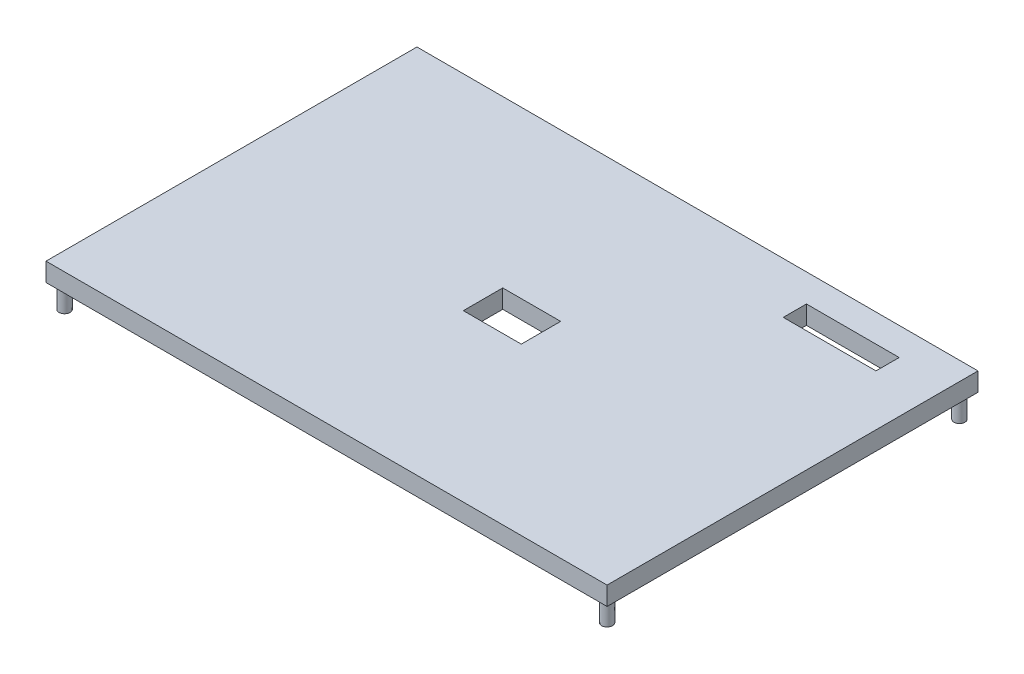
ISO-10303-21;
HEADER;
FILE_DESCRIPTION(('STEP AP214'),'2;1');
FILE_NAME('part.step','',(''),(''),'','','');
FILE_SCHEMA(('AUTOMOTIVE_DESIGN { 1 0 10303 214 1 1 1 1 }'));
ENDSEC;
DATA;
#1=APPLICATION_CONTEXT('core data for automotive mechanical design processes');
#2=APPLICATION_PROTOCOL_DEFINITION('international standard','automotive_design',2000,#1);
#3=PRODUCT_CONTEXT('',#1,'mechanical');
#4=PRODUCT('Part','Part','',(#3));
#5=PRODUCT_RELATED_PRODUCT_CATEGORY('part','',(#4));
#6=PRODUCT_DEFINITION_FORMATION('','',#4);
#7=PRODUCT_DEFINITION_CONTEXT('part definition',#1,'design');
#8=PRODUCT_DEFINITION('design','',#6,#7);
#9=PRODUCT_DEFINITION_SHAPE('','',#8);
#10=(LENGTH_UNIT() NAMED_UNIT(*) SI_UNIT(.MILLI.,.METRE.));
#11=(NAMED_UNIT(*) PLANE_ANGLE_UNIT() SI_UNIT($,.RADIAN.));
#12=(NAMED_UNIT(*) SI_UNIT($,.STERADIAN.) SOLID_ANGLE_UNIT());
#13=UNCERTAINTY_MEASURE_WITH_UNIT(LENGTH_MEASURE(1.E-05),#10,'distance_accuracy_value','');
#14=(GEOMETRIC_REPRESENTATION_CONTEXT(3) GLOBAL_UNCERTAINTY_ASSIGNED_CONTEXT((#13)) GLOBAL_UNIT_ASSIGNED_CONTEXT((#10,
#11,#12)) REPRESENTATION_CONTEXT('',''));
#15=CARTESIAN_POINT('',(0.,0.,0.));
#16=DIRECTION('',(0.,0.,1.));
#17=DIRECTION('',(1.,0.,0.));
#18=AXIS2_PLACEMENT_3D('',#15,#16,#17);
#19=CARTESIAN_POINT('',(0.,4.,0.));
#20=DIRECTION('',(0.,-1.,0.));
#21=DIRECTION('',(0.,0.,-1.));
#22=AXIS2_PLACEMENT_3D('',#19,#20,#21);
#23=PLANE('',#22);
#24=DIRECTION('',(0.,0.,1.));
#25=VECTOR('',#24,1.);
#26=CARTESIAN_POINT('',(29.5,4.,-34.));
#27=LINE('',#26,#25);
#28=CARTESIAN_POINT('',(29.5,4.,-34.));
#29=VERTEX_POINT('',#28);
#30=CARTESIAN_POINT('',(29.5,4.,-29.));
#31=VERTEX_POINT('',#30);
#32=EDGE_CURVE('E183',#29,#31,#27,.T.);
#33=ORIENTED_EDGE('',*,*,#32,.F.);
#34=DIRECTION('',(-1.,0.,0.));
#35=VECTOR('',#34,1.);
#36=CARTESIAN_POINT('',(29.5,4.,-34.));
#37=LINE('',#36,#35);
#38=CARTESIAN_POINT('',(49.5,4.,-34.));
#39=VERTEX_POINT('',#38);
#40=EDGE_CURVE('E194',#39,#29,#37,.T.);
#41=ORIENTED_EDGE('',*,*,#40,.F.);
#42=DIRECTION('',(0.,0.,-1.));
#43=VECTOR('',#42,1.);
#44=CARTESIAN_POINT('',(49.5,4.,-34.));
#45=LINE('',#44,#43);
#46=CARTESIAN_POINT('',(49.5,4.,-29.));
#47=VERTEX_POINT('',#46);
#48=EDGE_CURVE('E190',#47,#39,#45,.T.);
#49=ORIENTED_EDGE('',*,*,#48,.F.);
#50=DIRECTION('',(1.,0.,0.));
#51=VECTOR('',#50,1.);
#52=CARTESIAN_POINT('',(29.5,4.,-29.));
#53=LINE('',#52,#51);
#54=EDGE_CURVE('E186',#31,#47,#53,.T.);
#55=ORIENTED_EDGE('',*,*,#54,.F.);
#56=EDGE_LOOP('',(#33,#41,#49,#55));
#57=FACE_BOUND('',#56,.T.);
#58=DIRECTION('',(0.,0.,-1.));
#59=VECTOR('',#58,1.);
#60=CARTESIAN_POINT('',(60.5,4.,40.));
#61=LINE('',#60,#59);
#62=CARTESIAN_POINT('',(60.5,4.,40.));
#63=VERTEX_POINT('',#62);
#64=CARTESIAN_POINT('',(60.5,4.,-40.));
#65=VERTEX_POINT('',#64);
#66=EDGE_CURVE('E226',#63,#65,#61,.T.);
#67=ORIENTED_EDGE('',*,*,#66,.T.);
#68=DIRECTION('',(-1.,0.,0.));
#69=VECTOR('',#68,1.);
#70=CARTESIAN_POINT('',(-60.5,4.,-40.));
#71=LINE('',#70,#69);
#72=CARTESIAN_POINT('',(-60.5,4.,-40.));
#73=VERTEX_POINT('',#72);
#74=EDGE_CURVE('E230',#65,#73,#71,.T.);
#75=ORIENTED_EDGE('',*,*,#74,.T.);
#76=DIRECTION('',(0.,0.,1.));
#77=VECTOR('',#76,1.);
#78=CARTESIAN_POINT('',(-60.5,4.,40.));
#79=LINE('',#78,#77);
#80=CARTESIAN_POINT('',(-60.5,4.,40.));
#81=VERTEX_POINT('',#80);
#82=EDGE_CURVE('E234',#73,#81,#79,.T.);
#83=ORIENTED_EDGE('',*,*,#82,.T.);
#84=DIRECTION('',(1.,0.,0.));
#85=VECTOR('',#84,1.);
#86=CARTESIAN_POINT('',(-60.5,4.,40.));
#87=LINE('',#86,#85);
#88=EDGE_CURVE('E237',#81,#63,#87,.T.);
#89=ORIENTED_EDGE('',*,*,#88,.T.);
#90=EDGE_LOOP('',(#67,#75,#83,#89));
#91=FACE_BOUND('',#90,.T.);
#92=DIRECTION('',(0.,0.,-1.));
#93=VECTOR('',#92,1.);
#94=CARTESIAN_POINT('',(6.25,4.,4.25));
#95=LINE('',#94,#93);
#96=CARTESIAN_POINT('',(6.25,4.,4.25));
#97=VERTEX_POINT('',#96);
#98=CARTESIAN_POINT('',(6.25,4.,-4.25));
#99=VERTEX_POINT('',#98);
#100=EDGE_CURVE('E133',#97,#99,#95,.T.);
#101=ORIENTED_EDGE('',*,*,#100,.F.);
#102=DIRECTION('',(1.,0.,0.));
#103=VECTOR('',#102,1.);
#104=CARTESIAN_POINT('',(-6.25,4.,4.25));
#105=LINE('',#104,#103);
#106=CARTESIAN_POINT('',(-6.25,4.,4.25));
#107=VERTEX_POINT('',#106);
#108=EDGE_CURVE('E159',#107,#97,#105,.T.);
#109=ORIENTED_EDGE('',*,*,#108,.F.);
#110=DIRECTION('',(0.,0.,1.));
#111=VECTOR('',#110,1.);
#112=CARTESIAN_POINT('',(-6.25,4.,4.25));
#113=LINE('',#112,#111);
#114=CARTESIAN_POINT('',(-6.25,4.,-4.25));
#115=VERTEX_POINT('',#114);
#116=EDGE_CURVE('E155',#115,#107,#113,.T.);
#117=ORIENTED_EDGE('',*,*,#116,.F.);
#118=DIRECTION('',(-1.,0.,0.));
#119=VECTOR('',#118,1.);
#120=CARTESIAN_POINT('',(-6.25,4.,-4.25));
#121=LINE('',#120,#119);
#122=EDGE_CURVE('E142',#99,#115,#121,.T.);
#123=ORIENTED_EDGE('',*,*,#122,.F.);
#124=EDGE_LOOP('',(#101,#109,#117,#123));
#125=FACE_BOUND('',#124,.T.);
#126=ADVANCED_FACE('F43',(#57,#91,#125),#23,.F.);
#127=CARTESIAN_POINT('',(0.,0.,0.));
#128=DIRECTION('',(0.,-1.,0.));
#129=DIRECTION('',(0.,0.,-1.));
#130=AXIS2_PLACEMENT_3D('',#127,#128,#129);
#131=PLANE('',#130);
#132=CARTESIAN_POINT('',(58.5,0.,38.));
#133=DIRECTION('',(0.,-1.,0.));
#134=DIRECTION('',(0.,0.,-1.));
#135=AXIS2_PLACEMENT_3D('',#132,#133,#134);
#136=CIRCLE('',#135,1.185);
#137=CARTESIAN_POINT('',(58.5,0.,36.815));
#138=VERTEX_POINT('',#137);
#139=EDGE_CURVE('E380',#138,#138,#136,.T.);
#140=ORIENTED_EDGE('',*,*,#139,.F.);
#141=EDGE_LOOP('',(#140));
#142=FACE_BOUND('',#141,.T.);
#143=CARTESIAN_POINT('',(58.5,0.,-38.));
#144=DIRECTION('',(0.,-1.,0.));
#145=DIRECTION('',(0.,0.,1.));
#146=AXIS2_PLACEMENT_3D('',#143,#144,#145);
#147=CIRCLE('',#146,1.185);
#148=CARTESIAN_POINT('',(58.5,0.,-36.815));
#149=VERTEX_POINT('',#148);
#150=EDGE_CURVE('E387',#149,#149,#147,.T.);
#151=ORIENTED_EDGE('',*,*,#150,.F.);
#152=EDGE_LOOP('',(#151));
#153=FACE_BOUND('',#152,.T.);
#154=CARTESIAN_POINT('',(-58.5,0.,38.));
#155=DIRECTION('',(0.,-1.,0.));
#156=DIRECTION('',(0.,0.,1.));
#157=AXIS2_PLACEMENT_3D('',#154,#155,#156);
#158=CIRCLE('',#157,1.185);
#159=CARTESIAN_POINT('',(-58.5,0.,39.185));
#160=VERTEX_POINT('',#159);
#161=EDGE_CURVE('E395',#160,#160,#158,.T.);
#162=ORIENTED_EDGE('',*,*,#161,.F.);
#163=EDGE_LOOP('',(#162));
#164=FACE_BOUND('',#163,.T.);
#165=CARTESIAN_POINT('',(-58.5,0.,-38.));
#166=DIRECTION('',(0.,-1.,0.));
#167=DIRECTION('',(0.,0.,-1.));
#168=AXIS2_PLACEMENT_3D('',#165,#166,#167);
#169=CIRCLE('',#168,1.185);
#170=CARTESIAN_POINT('',(-58.5,0.,-39.185));
#171=VERTEX_POINT('',#170);
#172=EDGE_CURVE('E399',#171,#171,#169,.T.);
#173=ORIENTED_EDGE('',*,*,#172,.F.);
#174=EDGE_LOOP('',(#173));
#175=FACE_BOUND('',#174,.T.);
#176=DIRECTION('',(0.,0.,-1.));
#177=VECTOR('',#176,1.);
#178=CARTESIAN_POINT('',(60.5,0.,40.));
#179=LINE('',#178,#177);
#180=CARTESIAN_POINT('',(60.5,0.,40.));
#181=VERTEX_POINT('',#180);
#182=CARTESIAN_POINT('',(60.5,0.,-40.));
#183=VERTEX_POINT('',#182);
#184=EDGE_CURVE('E225',#181,#183,#179,.T.);
#185=ORIENTED_EDGE('',*,*,#184,.F.);
#186=DIRECTION('',(1.,0.,0.));
#187=VECTOR('',#186,1.);
#188=CARTESIAN_POINT('',(-60.5,0.,40.));
#189=LINE('',#188,#187);
#190=CARTESIAN_POINT('',(-60.5,0.,40.));
#191=VERTEX_POINT('',#190);
#192=EDGE_CURVE('E231',#191,#181,#189,.T.);
#193=ORIENTED_EDGE('',*,*,#192,.F.);
#194=DIRECTION('',(0.,0.,1.));
#195=VECTOR('',#194,1.);
#196=CARTESIAN_POINT('',(-60.5,0.,40.));
#197=LINE('',#196,#195);
#198=CARTESIAN_POINT('',(-60.5,0.,-40.));
#199=VERTEX_POINT('',#198);
#200=EDGE_CURVE('E247',#199,#191,#197,.T.);
#201=ORIENTED_EDGE('',*,*,#200,.F.);
#202=DIRECTION('',(-1.,0.,0.));
#203=VECTOR('',#202,1.);
#204=CARTESIAN_POINT('',(-60.5,0.,-40.));
#205=LINE('',#204,#203);
#206=EDGE_CURVE('E244',#183,#199,#205,.T.);
#207=ORIENTED_EDGE('',*,*,#206,.F.);
#208=EDGE_LOOP('',(#185,#193,#201,#207));
#209=FACE_BOUND('',#208,.T.);
#210=DIRECTION('',(-1.,0.,0.));
#211=VECTOR('',#210,1.);
#212=CARTESIAN_POINT('',(29.5,0.,-34.));
#213=LINE('',#212,#211);
#214=CARTESIAN_POINT('',(49.5,0.,-34.));
#215=VERTEX_POINT('',#214);
#216=CARTESIAN_POINT('',(29.5,0.,-34.));
#217=VERTEX_POINT('',#216);
#218=EDGE_CURVE('E187',#215,#217,#213,.T.);
#219=ORIENTED_EDGE('',*,*,#218,.T.);
#220=DIRECTION('',(0.,0.,1.));
#221=VECTOR('',#220,1.);
#222=CARTESIAN_POINT('',(29.5,0.,-34.));
#223=LINE('',#222,#221);
#224=CARTESIAN_POINT('',(29.5,0.,-29.));
#225=VERTEX_POINT('',#224);
#226=EDGE_CURVE('E151',#217,#225,#223,.T.);
#227=ORIENTED_EDGE('',*,*,#226,.T.);
#228=DIRECTION('',(1.,0.,0.));
#229=VECTOR('',#228,1.);
#230=CARTESIAN_POINT('',(29.5,0.,-29.));
#231=LINE('',#230,#229);
#232=CARTESIAN_POINT('',(49.5,0.,-29.));
#233=VERTEX_POINT('',#232);
#234=EDGE_CURVE('E201',#225,#233,#231,.T.);
#235=ORIENTED_EDGE('',*,*,#234,.T.);
#236=DIRECTION('',(0.,0.,-1.));
#237=VECTOR('',#236,1.);
#238=CARTESIAN_POINT('',(49.5,0.,-34.));
#239=LINE('',#238,#237);
#240=EDGE_CURVE('E205',#233,#215,#239,.T.);
#241=ORIENTED_EDGE('',*,*,#240,.T.);
#242=EDGE_LOOP('',(#219,#227,#235,#241));
#243=FACE_BOUND('',#242,.T.);
#244=DIRECTION('',(1.,0.,0.));
#245=VECTOR('',#244,1.);
#246=CARTESIAN_POINT('',(-6.25,0.,4.25));
#247=LINE('',#246,#245);
#248=CARTESIAN_POINT('',(-6.25,0.,4.25));
#249=VERTEX_POINT('',#248);
#250=CARTESIAN_POINT('',(6.25,0.,4.25));
#251=VERTEX_POINT('',#250);
#252=EDGE_CURVE('E143',#249,#251,#247,.T.);
#253=ORIENTED_EDGE('',*,*,#252,.T.);
#254=DIRECTION('',(0.,0.,-1.));
#255=VECTOR('',#254,1.);
#256=CARTESIAN_POINT('',(6.25,0.,4.25));
#257=LINE('',#256,#255);
#258=CARTESIAN_POINT('',(6.25,0.,-4.25));
#259=VERTEX_POINT('',#258);
#260=EDGE_CURVE('E67',#251,#259,#257,.T.);
#261=ORIENTED_EDGE('',*,*,#260,.T.);
#262=DIRECTION('',(-1.,0.,0.));
#263=VECTOR('',#262,1.);
#264=CARTESIAN_POINT('',(-6.25,0.,-4.25));
#265=LINE('',#264,#263);
#266=CARTESIAN_POINT('',(-6.25,0.,-4.25));
#267=VERTEX_POINT('',#266);
#268=EDGE_CURVE('E149',#259,#267,#265,.T.);
#269=ORIENTED_EDGE('',*,*,#268,.T.);
#270=DIRECTION('',(0.,0.,1.));
#271=VECTOR('',#270,1.);
#272=CARTESIAN_POINT('',(-6.25,0.,4.25));
#273=LINE('',#272,#271);
#274=EDGE_CURVE('E170',#267,#249,#273,.T.);
#275=ORIENTED_EDGE('',*,*,#274,.T.);
#276=EDGE_LOOP('',(#253,#261,#269,#275));
#277=FACE_BOUND('',#276,.T.);
#278=ADVANCED_FACE('F270',(#142,#153,#164,#175,#209,#243,#277),#131,.T.);
#279=CARTESIAN_POINT('',(60.5,4.,40.));
#280=DIRECTION('',(-1.,0.,0.));
#281=DIRECTION('',(0.,0.,1.));
#282=AXIS2_PLACEMENT_3D('',#279,#280,#281);
#283=PLANE('',#282);
#284=ORIENTED_EDGE('',*,*,#184,.T.);
#285=DIRECTION('',(0.,-1.,0.));
#286=VECTOR('',#285,1.);
#287=CARTESIAN_POINT('',(60.5,4.,-40.));
#288=LINE('',#287,#286);
#289=EDGE_CURVE('E11',#65,#183,#288,.T.);
#290=ORIENTED_EDGE('',*,*,#289,.F.);
#291=ORIENTED_EDGE('',*,*,#66,.F.);
#292=DIRECTION('',(0.,-1.,0.));
#293=VECTOR('',#292,1.);
#294=CARTESIAN_POINT('',(60.5,4.,40.));
#295=LINE('',#294,#293);
#296=EDGE_CURVE('E240',#63,#181,#295,.T.);
#297=ORIENTED_EDGE('',*,*,#296,.T.);
#298=EDGE_LOOP('',(#284,#290,#291,#297));
#299=FACE_BOUND('',#298,.T.);
#300=ADVANCED_FACE('F45',(#299),#283,.F.);
#301=CARTESIAN_POINT('',(-60.5,4.,-40.));
#302=DIRECTION('',(0.,0.,1.));
#303=DIRECTION('',(1.,0.,0.));
#304=AXIS2_PLACEMENT_3D('',#301,#302,#303);
#305=PLANE('',#304);
#306=ORIENTED_EDGE('',*,*,#206,.T.);
#307=DIRECTION('',(0.,-1.,0.));
#308=VECTOR('',#307,1.);
#309=CARTESIAN_POINT('',(-60.5,4.,-40.));
#310=LINE('',#309,#308);
#311=EDGE_CURVE('E52',#73,#199,#310,.T.);
#312=ORIENTED_EDGE('',*,*,#311,.F.);
#313=ORIENTED_EDGE('',*,*,#74,.F.);
#314=ORIENTED_EDGE('',*,*,#289,.T.);
#315=EDGE_LOOP('',(#306,#312,#313,#314));
#316=FACE_BOUND('',#315,.T.);
#317=ADVANCED_FACE('F280',(#316),#305,.F.);
#318=CARTESIAN_POINT('',(-60.5,4.,40.));
#319=DIRECTION('',(1.,0.,0.));
#320=DIRECTION('',(0.,0.,-1.));
#321=AXIS2_PLACEMENT_3D('',#318,#319,#320);
#322=PLANE('',#321);
#323=ORIENTED_EDGE('',*,*,#200,.T.);
#324=DIRECTION('',(0.,-1.,0.));
#325=VECTOR('',#324,1.);
#326=CARTESIAN_POINT('',(-60.5,4.,40.));
#327=LINE('',#326,#325);
#328=EDGE_CURVE('E255',#81,#191,#327,.T.);
#329=ORIENTED_EDGE('',*,*,#328,.F.);
#330=ORIENTED_EDGE('',*,*,#82,.F.);
#331=ORIENTED_EDGE('',*,*,#311,.T.);
#332=EDGE_LOOP('',(#323,#329,#330,#331));
#333=FACE_BOUND('',#332,.T.);
#334=ADVANCED_FACE('F264',(#333),#322,.F.);
#335=CARTESIAN_POINT('',(-60.5,4.,40.));
#336=DIRECTION('',(0.,0.,-1.));
#337=DIRECTION('',(-1.,0.,0.));
#338=AXIS2_PLACEMENT_3D('',#335,#336,#337);
#339=PLANE('',#338);
#340=ORIENTED_EDGE('',*,*,#192,.T.);
#341=ORIENTED_EDGE('',*,*,#296,.F.);
#342=ORIENTED_EDGE('',*,*,#88,.F.);
#343=ORIENTED_EDGE('',*,*,#328,.T.);
#344=EDGE_LOOP('',(#340,#341,#342,#343));
#345=FACE_BOUND('',#344,.T.);
#346=ADVANCED_FACE('F274',(#345),#339,.F.);
#347=CARTESIAN_POINT('',(29.5,4.,-34.));
#348=DIRECTION('',(1.,0.,0.));
#349=DIRECTION('',(0.,0.,-1.));
#350=AXIS2_PLACEMENT_3D('',#347,#348,#349);
#351=PLANE('',#350);
#352=ORIENTED_EDGE('',*,*,#226,.F.);
#353=DIRECTION('',(0.,-1.,0.));
#354=VECTOR('',#353,1.);
#355=CARTESIAN_POINT('',(29.5,4.,-34.));
#356=LINE('',#355,#354);
#357=EDGE_CURVE('E197',#29,#217,#356,.T.);
#358=ORIENTED_EDGE('',*,*,#357,.F.);
#359=ORIENTED_EDGE('',*,*,#32,.T.);
#360=DIRECTION('',(0.,-1.,0.));
#361=VECTOR('',#360,1.);
#362=CARTESIAN_POINT('',(29.5,4.,-29.));
#363=LINE('',#362,#361);
#364=EDGE_CURVE('E221',#31,#225,#363,.T.);
#365=ORIENTED_EDGE('',*,*,#364,.T.);
#366=EDGE_LOOP('',(#352,#358,#359,#365));
#367=FACE_BOUND('',#366,.T.);
#368=ADVANCED_FACE('F297',(#367),#351,.T.);
#369=CARTESIAN_POINT('',(29.5,4.,-29.));
#370=DIRECTION('',(0.,0.,-1.));
#371=DIRECTION('',(-1.,0.,0.));
#372=AXIS2_PLACEMENT_3D('',#369,#370,#371);
#373=PLANE('',#372);
#374=ORIENTED_EDGE('',*,*,#234,.F.);
#375=ORIENTED_EDGE('',*,*,#364,.F.);
#376=ORIENTED_EDGE('',*,*,#54,.T.);
#377=DIRECTION('',(0.,-1.,0.));
#378=VECTOR('',#377,1.);
#379=CARTESIAN_POINT('',(49.5,4.,-29.));
#380=LINE('',#379,#378);
#381=EDGE_CURVE('E218',#47,#233,#380,.T.);
#382=ORIENTED_EDGE('',*,*,#381,.T.);
#383=EDGE_LOOP('',(#374,#375,#376,#382));
#384=FACE_BOUND('',#383,.T.);
#385=ADVANCED_FACE('F304',(#384),#373,.T.);
#386=CARTESIAN_POINT('',(49.5,4.,-34.));
#387=DIRECTION('',(-1.,0.,0.));
#388=DIRECTION('',(0.,0.,1.));
#389=AXIS2_PLACEMENT_3D('',#386,#387,#388);
#390=PLANE('',#389);
#391=ORIENTED_EDGE('',*,*,#240,.F.);
#392=ORIENTED_EDGE('',*,*,#381,.F.);
#393=ORIENTED_EDGE('',*,*,#48,.T.);
#394=DIRECTION('',(0.,-1.,0.));
#395=VECTOR('',#394,1.);
#396=CARTESIAN_POINT('',(49.5,4.,-34.));
#397=LINE('',#396,#395);
#398=EDGE_CURVE('E215',#39,#215,#397,.T.);
#399=ORIENTED_EDGE('',*,*,#398,.T.);
#400=EDGE_LOOP('',(#391,#392,#393,#399));
#401=FACE_BOUND('',#400,.T.);
#402=ADVANCED_FACE('F309',(#401),#390,.T.);
#403=CARTESIAN_POINT('',(29.5,4.,-34.));
#404=DIRECTION('',(0.,0.,1.));
#405=DIRECTION('',(1.,0.,0.));
#406=AXIS2_PLACEMENT_3D('',#403,#404,#405);
#407=PLANE('',#406);
#408=ORIENTED_EDGE('',*,*,#218,.F.);
#409=ORIENTED_EDGE('',*,*,#398,.F.);
#410=ORIENTED_EDGE('',*,*,#40,.T.);
#411=ORIENTED_EDGE('',*,*,#357,.T.);
#412=EDGE_LOOP('',(#408,#409,#410,#411));
#413=FACE_BOUND('',#412,.T.);
#414=ADVANCED_FACE('F315',(#413),#407,.T.);
#415=CARTESIAN_POINT('',(6.25,4.,4.25));
#416=DIRECTION('',(-1.,0.,0.));
#417=DIRECTION('',(0.,0.,1.));
#418=AXIS2_PLACEMENT_3D('',#415,#416,#417);
#419=PLANE('',#418);
#420=ORIENTED_EDGE('',*,*,#260,.F.);
#421=DIRECTION('',(0.,-1.,0.));
#422=VECTOR('',#421,1.);
#423=CARTESIAN_POINT('',(6.25,4.,4.25));
#424=LINE('',#423,#422);
#425=EDGE_CURVE('E137',#97,#251,#424,.T.);
#426=ORIENTED_EDGE('',*,*,#425,.F.);
#427=ORIENTED_EDGE('',*,*,#100,.T.);
#428=DIRECTION('',(0.,-1.,0.));
#429=VECTOR('',#428,1.);
#430=CARTESIAN_POINT('',(6.25,4.,-4.25));
#431=LINE('',#430,#429);
#432=EDGE_CURVE('E136',#99,#259,#431,.T.);
#433=ORIENTED_EDGE('',*,*,#432,.T.);
#434=EDGE_LOOP('',(#420,#426,#427,#433));
#435=FACE_BOUND('',#434,.T.);
#436=ADVANCED_FACE('F135',(#435),#419,.T.);
#437=CARTESIAN_POINT('',(-6.25,4.,-4.25));
#438=DIRECTION('',(0.,0.,1.));
#439=DIRECTION('',(1.,0.,0.));
#440=AXIS2_PLACEMENT_3D('',#437,#438,#439);
#441=PLANE('',#440);
#442=ORIENTED_EDGE('',*,*,#268,.F.);
#443=ORIENTED_EDGE('',*,*,#432,.F.);
#444=ORIENTED_EDGE('',*,*,#122,.T.);
#445=DIRECTION('',(0.,-1.,0.));
#446=VECTOR('',#445,1.);
#447=CARTESIAN_POINT('',(-6.25,4.,-4.25));
#448=LINE('',#447,#446);
#449=EDGE_CURVE('E152',#115,#267,#448,.T.);
#450=ORIENTED_EDGE('',*,*,#449,.T.);
#451=EDGE_LOOP('',(#442,#443,#444,#450));
#452=FACE_BOUND('',#451,.T.);
#453=ADVANCED_FACE('F146',(#452),#441,.T.);
#454=CARTESIAN_POINT('',(-6.25,4.,4.25));
#455=DIRECTION('',(1.,0.,0.));
#456=DIRECTION('',(0.,0.,-1.));
#457=AXIS2_PLACEMENT_3D('',#454,#455,#456);
#458=PLANE('',#457);
#459=ORIENTED_EDGE('',*,*,#274,.F.);
#460=ORIENTED_EDGE('',*,*,#449,.F.);
#461=ORIENTED_EDGE('',*,*,#116,.T.);
#462=DIRECTION('',(0.,-1.,0.));
#463=VECTOR('',#462,1.);
#464=CARTESIAN_POINT('',(-6.25,4.,4.25));
#465=LINE('',#464,#463);
#466=EDGE_CURVE('E59',#107,#249,#465,.T.);
#467=ORIENTED_EDGE('',*,*,#466,.T.);
#468=EDGE_LOOP('',(#459,#460,#461,#467));
#469=FACE_BOUND('',#468,.T.);
#470=ADVANCED_FACE('F334',(#469),#458,.T.);
#471=CARTESIAN_POINT('',(-6.25,4.,4.25));
#472=DIRECTION('',(0.,0.,-1.));
#473=DIRECTION('',(-1.,0.,0.));
#474=AXIS2_PLACEMENT_3D('',#471,#472,#473);
#475=PLANE('',#474);
#476=ORIENTED_EDGE('',*,*,#252,.F.);
#477=ORIENTED_EDGE('',*,*,#466,.F.);
#478=ORIENTED_EDGE('',*,*,#108,.T.);
#479=ORIENTED_EDGE('',*,*,#425,.T.);
#480=EDGE_LOOP('',(#476,#477,#478,#479));
#481=FACE_BOUND('',#480,.T.);
#482=ADVANCED_FACE('F337',(#481),#475,.T.);
#483=CARTESIAN_POINT('',(-58.5,-5.,-38.));
#484=DIRECTION('',(0.,1.,0.));
#485=DIRECTION('',(0.,0.,1.));
#486=AXIS2_PLACEMENT_3D('',#483,#484,#485);
#487=CYLINDRICAL_SURFACE('',#486,1.185);
#488=CARTESIAN_POINT('',(-58.5,-5.,-38.));
#489=DIRECTION('',(0.,-1.,0.));
#490=DIRECTION('',(0.,0.,-1.));
#491=AXIS2_PLACEMENT_3D('',#488,#489,#490);
#492=CIRCLE('',#491,1.185);
#493=CARTESIAN_POINT('',(-58.5,-5.,-39.185));
#494=VERTEX_POINT('',#493);
#495=EDGE_CURVE('E167',#494,#494,#492,.T.);
#496=ORIENTED_EDGE('',*,*,#495,.F.);
#497=EDGE_LOOP('',(#496));
#498=FACE_BOUND('',#497,.T.);
#499=ORIENTED_EDGE('',*,*,#172,.T.);
#500=EDGE_LOOP('',(#499));
#501=FACE_BOUND('',#500,.T.);
#502=ADVANCED_FACE('F341',(#498,#501),#487,.T.);
#503=CARTESIAN_POINT('',(-58.5,-5.,-38.));
#504=DIRECTION('',(0.,-1.,0.));
#505=DIRECTION('',(0.,0.,-1.));
#506=AXIS2_PLACEMENT_3D('',#503,#504,#505);
#507=PLANE('',#506);
#508=ORIENTED_EDGE('',*,*,#495,.T.);
#509=EDGE_LOOP('',(#508));
#510=FACE_BOUND('',#509,.T.);
#511=ADVANCED_FACE('F344',(#510),#507,.T.);
#512=CARTESIAN_POINT('',(-58.5,-5.,38.));
#513=DIRECTION('',(0.,1.,0.));
#514=DIRECTION('',(0.,0.,1.));
#515=AXIS2_PLACEMENT_3D('',#512,#513,#514);
#516=CYLINDRICAL_SURFACE('',#515,1.185);
#517=CARTESIAN_POINT('',(-58.5,-5.,38.));
#518=DIRECTION('',(0.,-1.,0.));
#519=DIRECTION('',(0.,0.,1.));
#520=AXIS2_PLACEMENT_3D('',#517,#518,#519);
#521=CIRCLE('',#520,1.185);
#522=CARTESIAN_POINT('',(-58.5,-5.,39.185));
#523=VERTEX_POINT('',#522);
#524=EDGE_CURVE('E393',#523,#523,#521,.T.);
#525=ORIENTED_EDGE('',*,*,#524,.F.);
#526=EDGE_LOOP('',(#525));
#527=FACE_BOUND('',#526,.T.);
#528=ORIENTED_EDGE('',*,*,#161,.T.);
#529=EDGE_LOOP('',(#528));
#530=FACE_BOUND('',#529,.T.);
#531=ADVANCED_FACE('F348',(#527,#530),#516,.T.);
#532=CARTESIAN_POINT('',(-58.5,-5.,38.));
#533=DIRECTION('',(0.,1.,0.));
#534=DIRECTION('',(0.,0.,1.));
#535=AXIS2_PLACEMENT_3D('',#532,#533,#534);
#536=PLANE('',#535);
#537=ORIENTED_EDGE('',*,*,#524,.T.);
#538=EDGE_LOOP('',(#537));
#539=FACE_BOUND('',#538,.T.);
#540=ADVANCED_FACE('F350',(#539),#536,.F.);
#541=CARTESIAN_POINT('',(58.5,-5.,-38.));
#542=DIRECTION('',(0.,1.,0.));
#543=DIRECTION('',(0.,0.,1.));
#544=AXIS2_PLACEMENT_3D('',#541,#542,#543);
#545=CYLINDRICAL_SURFACE('',#544,1.185);
#546=CARTESIAN_POINT('',(58.5,-5.,-38.));
#547=DIRECTION('',(0.,-1.,0.));
#548=DIRECTION('',(0.,0.,1.));
#549=AXIS2_PLACEMENT_3D('',#546,#547,#548);
#550=CIRCLE('',#549,1.185);
#551=CARTESIAN_POINT('',(58.5,-5.,-36.815));
#552=VERTEX_POINT('',#551);
#553=EDGE_CURVE('E382',#552,#552,#550,.T.);
#554=ORIENTED_EDGE('',*,*,#553,.F.);
#555=EDGE_LOOP('',(#554));
#556=FACE_BOUND('',#555,.T.);
#557=ORIENTED_EDGE('',*,*,#150,.T.);
#558=EDGE_LOOP('',(#557));
#559=FACE_BOUND('',#558,.T.);
#560=ADVANCED_FACE('F353',(#556,#559),#545,.T.);
#561=CARTESIAN_POINT('',(58.5,-5.,-38.));
#562=DIRECTION('',(0.,1.,0.));
#563=DIRECTION('',(0.,0.,1.));
#564=AXIS2_PLACEMENT_3D('',#561,#562,#563);
#565=PLANE('',#564);
#566=ORIENTED_EDGE('',*,*,#553,.T.);
#567=EDGE_LOOP('',(#566));
#568=FACE_BOUND('',#567,.T.);
#569=ADVANCED_FACE('F358',(#568),#565,.F.);
#570=CARTESIAN_POINT('',(58.5,-5.,38.));
#571=DIRECTION('',(0.,1.,0.));
#572=DIRECTION('',(0.,0.,1.));
#573=AXIS2_PLACEMENT_3D('',#570,#571,#572);
#574=CYLINDRICAL_SURFACE('',#573,1.185);
#575=CARTESIAN_POINT('',(58.5,-5.,38.));
#576=DIRECTION('',(0.,-1.,0.));
#577=DIRECTION('',(0.,0.,-1.));
#578=AXIS2_PLACEMENT_3D('',#575,#576,#577);
#579=CIRCLE('',#578,1.185);
#580=CARTESIAN_POINT('',(58.5,-5.,36.815));
#581=VERTEX_POINT('',#580);
#582=EDGE_CURVE('E377',#581,#581,#579,.T.);
#583=ORIENTED_EDGE('',*,*,#582,.F.);
#584=EDGE_LOOP('',(#583));
#585=FACE_BOUND('',#584,.T.);
#586=ORIENTED_EDGE('',*,*,#139,.T.);
#587=EDGE_LOOP('',(#586));
#588=FACE_BOUND('',#587,.T.);
#589=ADVANCED_FACE('F361',(#585,#588),#574,.T.);
#590=CARTESIAN_POINT('',(58.5,-5.,38.));
#591=DIRECTION('',(0.,-1.,0.));
#592=DIRECTION('',(0.,0.,-1.));
#593=AXIS2_PLACEMENT_3D('',#590,#591,#592);
#594=PLANE('',#593);
#595=ORIENTED_EDGE('',*,*,#582,.T.);
#596=EDGE_LOOP('',(#595));
#597=FACE_BOUND('',#596,.T.);
#598=ADVANCED_FACE('F366',(#597),#594,.T.);
#599=CLOSED_SHELL('',(#126,#278,#300,#317,#334,#346,#368,#385,#402,#414,#436,#453,#470,#482,
#502,#511,#531,#540,#560,#569,#589,#598));
#600=MANIFOLD_SOLID_BREP('B2',#599);
#601=ADVANCED_BREP_SHAPE_REPRESENTATION('',(#18,#600),#14);
#602=SHAPE_DEFINITION_REPRESENTATION(#9,#601);
ENDSEC;
END-ISO-10303-21;
